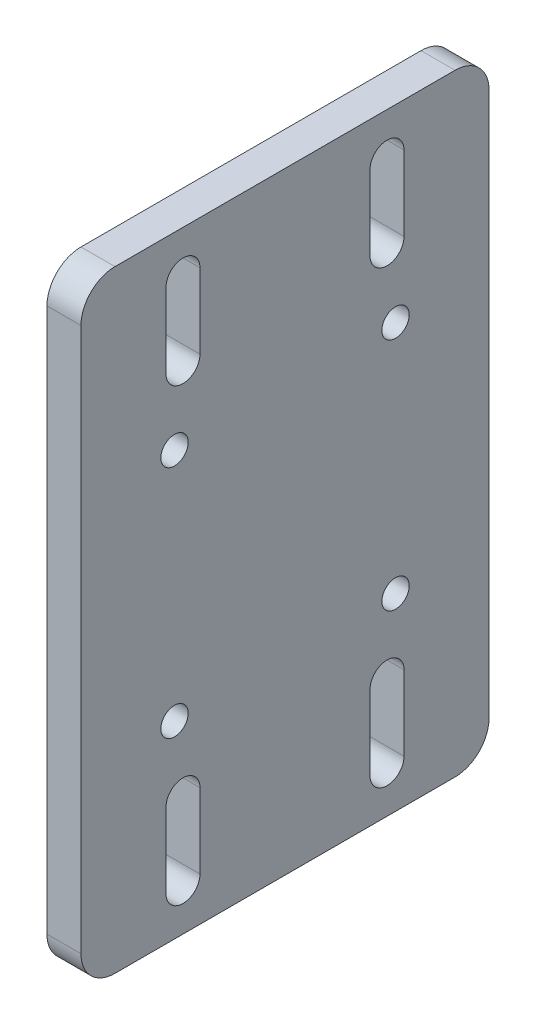
ISO-10303-21;
HEADER;
FILE_DESCRIPTION(('STEP AP214'),'2;1');
FILE_NAME('part.step','',(''),(''),'','','');
FILE_SCHEMA(('AUTOMOTIVE_DESIGN { 1 0 10303 214 1 1 1 1 }'));
ENDSEC;
DATA;
#1=APPLICATION_CONTEXT('core data for automotive mechanical design processes');
#2=APPLICATION_PROTOCOL_DEFINITION('international standard','automotive_design',2000,#1);
#3=PRODUCT_CONTEXT('',#1,'mechanical');
#4=PRODUCT('Part','Part','',(#3));
#5=PRODUCT_RELATED_PRODUCT_CATEGORY('part','',(#4));
#6=PRODUCT_DEFINITION_FORMATION('','',#4);
#7=PRODUCT_DEFINITION_CONTEXT('part definition',#1,'design');
#8=PRODUCT_DEFINITION('design','',#6,#7);
#9=PRODUCT_DEFINITION_SHAPE('','',#8);
#10=(LENGTH_UNIT() NAMED_UNIT(*) SI_UNIT(.MILLI.,.METRE.));
#11=(NAMED_UNIT(*) PLANE_ANGLE_UNIT() SI_UNIT($,.RADIAN.));
#12=(NAMED_UNIT(*) SI_UNIT($,.STERADIAN.) SOLID_ANGLE_UNIT());
#13=UNCERTAINTY_MEASURE_WITH_UNIT(LENGTH_MEASURE(1.E-05),#10,'distance_accuracy_value','');
#14=(GEOMETRIC_REPRESENTATION_CONTEXT(3) GLOBAL_UNCERTAINTY_ASSIGNED_CONTEXT((#13)) GLOBAL_UNIT_ASSIGNED_CONTEXT((#10,
#11,#12)) REPRESENTATION_CONTEXT('',''));
#15=CARTESIAN_POINT('',(0.,0.,0.));
#16=DIRECTION('',(0.,0.,1.));
#17=DIRECTION('',(1.,0.,0.));
#18=AXIS2_PLACEMENT_3D('',#15,#16,#17);
#19=CARTESIAN_POINT('',(6.35,-57.15,-38.1));
#20=DIRECTION('',(0.,0.,1.));
#21=DIRECTION('',(1.,0.,0.));
#22=AXIS2_PLACEMENT_3D('',#19,#20,#21);
#23=PLANE('',#22);
#24=DIRECTION('',(0.,1.,0.));
#25=VECTOR('',#24,1.);
#26=CARTESIAN_POINT('',(6.35,-57.15,-38.1));
#27=LINE('',#26,#25);
#28=CARTESIAN_POINT('',(6.35,-50.8,-38.1));
#29=VERTEX_POINT('',#28);
#30=CARTESIAN_POINT('',(6.35,50.8,-38.1));
#31=VERTEX_POINT('',#30);
#32=EDGE_CURVE('E436',#29,#31,#27,.T.);
#33=ORIENTED_EDGE('',*,*,#32,.F.);
#34=DIRECTION('',(-1.,0.,0.));
#35=VECTOR('',#34,1.);
#36=CARTESIAN_POINT('',(6.35,-50.8,-38.1));
#37=LINE('',#36,#35);
#38=CARTESIAN_POINT('',(0.,-50.8,-38.1));
#39=VERTEX_POINT('',#38);
#40=EDGE_CURVE('E504',#29,#39,#37,.T.);
#41=ORIENTED_EDGE('',*,*,#40,.T.);
#42=DIRECTION('',(0.,1.,0.));
#43=VECTOR('',#42,1.);
#44=CARTESIAN_POINT('',(0.,-57.15,-38.1));
#45=LINE('',#44,#43);
#46=CARTESIAN_POINT('',(0.,50.8,-38.1));
#47=VERTEX_POINT('',#46);
#48=EDGE_CURVE('E435',#39,#47,#45,.T.);
#49=ORIENTED_EDGE('',*,*,#48,.T.);
#50=DIRECTION('',(-1.,0.,0.));
#51=VECTOR('',#50,1.);
#52=CARTESIAN_POINT('',(6.35,50.8,-38.1));
#53=LINE('',#52,#51);
#54=EDGE_CURVE('E501',#47,#31,#53,.F.);
#55=ORIENTED_EDGE('',*,*,#54,.T.);
#56=EDGE_LOOP('',(#33,#41,#49,#55));
#57=FACE_BOUND('',#56,.T.);
#58=ADVANCED_FACE('F53',(#57),#23,.F.);
#59=CARTESIAN_POINT('',(6.35,57.15,38.1));
#60=DIRECTION('',(0.,-1.,0.));
#61=DIRECTION('',(0.,0.,-1.));
#62=AXIS2_PLACEMENT_3D('',#59,#60,#61);
#63=PLANE('',#62);
#64=DIRECTION('',(0.,0.,1.));
#65=VECTOR('',#64,1.);
#66=CARTESIAN_POINT('',(6.35,57.15,38.1));
#67=LINE('',#66,#65);
#68=CARTESIAN_POINT('',(6.35,57.15,-31.75));
#69=VERTEX_POINT('',#68);
#70=CARTESIAN_POINT('',(6.35,57.15,31.75));
#71=VERTEX_POINT('',#70);
#72=EDGE_CURVE('E439',#69,#71,#67,.T.);
#73=ORIENTED_EDGE('',*,*,#72,.F.);
#74=DIRECTION('',(-1.,0.,0.));
#75=VECTOR('',#74,1.);
#76=CARTESIAN_POINT('',(6.35,57.15,-31.75));
#77=LINE('',#76,#75);
#78=CARTESIAN_POINT('',(0.,57.15,-31.75));
#79=VERTEX_POINT('',#78);
#80=EDGE_CURVE('E11',#69,#79,#77,.T.);
#81=ORIENTED_EDGE('',*,*,#80,.T.);
#82=DIRECTION('',(0.,0.,1.));
#83=VECTOR('',#82,1.);
#84=CARTESIAN_POINT('',(0.,57.15,38.1));
#85=LINE('',#84,#83);
#86=CARTESIAN_POINT('',(0.,57.15,31.75));
#87=VERTEX_POINT('',#86);
#88=EDGE_CURVE('E455',#79,#87,#85,.T.);
#89=ORIENTED_EDGE('',*,*,#88,.T.);
#90=DIRECTION('',(-1.,0.,0.));
#91=VECTOR('',#90,1.);
#92=CARTESIAN_POINT('',(6.35,57.15,31.75));
#93=LINE('',#92,#91);
#94=EDGE_CURVE('E62',#87,#71,#93,.F.);
#95=ORIENTED_EDGE('',*,*,#94,.T.);
#96=EDGE_LOOP('',(#73,#81,#89,#95));
#97=FACE_BOUND('',#96,.T.);
#98=ADVANCED_FACE('F521',(#97),#63,.F.);
#99=CARTESIAN_POINT('',(6.35,-57.15,38.1));
#100=DIRECTION('',(0.,0.,-1.));
#101=DIRECTION('',(-1.,0.,0.));
#102=AXIS2_PLACEMENT_3D('',#99,#100,#101);
#103=PLANE('',#102);
#104=DIRECTION('',(0.,-1.,0.));
#105=VECTOR('',#104,1.);
#106=CARTESIAN_POINT('',(0.,-57.15,38.1));
#107=LINE('',#106,#105);
#108=CARTESIAN_POINT('',(0.,50.8,38.1));
#109=VERTEX_POINT('',#108);
#110=CARTESIAN_POINT('',(0.,-50.8,38.1));
#111=VERTEX_POINT('',#110);
#112=EDGE_CURVE('E458',#109,#111,#107,.T.);
#113=ORIENTED_EDGE('',*,*,#112,.T.);
#114=DIRECTION('',(-1.,0.,0.));
#115=VECTOR('',#114,1.);
#116=CARTESIAN_POINT('',(6.35,-50.8,38.1));
#117=LINE('',#116,#115);
#118=CARTESIAN_POINT('',(6.35,-50.8,38.1));
#119=VERTEX_POINT('',#118);
#120=EDGE_CURVE('E487',#111,#119,#117,.F.);
#121=ORIENTED_EDGE('',*,*,#120,.T.);
#122=DIRECTION('',(0.,-1.,0.));
#123=VECTOR('',#122,1.);
#124=CARTESIAN_POINT('',(6.35,-57.15,38.1));
#125=LINE('',#124,#123);
#126=CARTESIAN_POINT('',(6.35,50.8,38.1));
#127=VERTEX_POINT('',#126);
#128=EDGE_CURVE('E443',#127,#119,#125,.T.);
#129=ORIENTED_EDGE('',*,*,#128,.F.);
#130=DIRECTION('',(-1.,0.,0.));
#131=VECTOR('',#130,1.);
#132=CARTESIAN_POINT('',(6.35,50.8,38.1));
#133=LINE('',#132,#131);
#134=EDGE_CURVE('E483',#127,#109,#133,.T.);
#135=ORIENTED_EDGE('',*,*,#134,.T.);
#136=EDGE_LOOP('',(#113,#121,#129,#135));
#137=FACE_BOUND('',#136,.T.);
#138=ADVANCED_FACE('F529',(#137),#103,.F.);
#139=CARTESIAN_POINT('',(6.35,-57.15,38.1));
#140=DIRECTION('',(0.,1.,0.));
#141=DIRECTION('',(0.,0.,1.));
#142=AXIS2_PLACEMENT_3D('',#139,#140,#141);
#143=PLANE('',#142);
#144=DIRECTION('',(0.,0.,-1.));
#145=VECTOR('',#144,1.);
#146=CARTESIAN_POINT('',(6.35,-57.15,38.1));
#147=LINE('',#146,#145);
#148=CARTESIAN_POINT('',(6.35,-57.15,31.75));
#149=VERTEX_POINT('',#148);
#150=CARTESIAN_POINT('',(6.35,-57.15,-31.75));
#151=VERTEX_POINT('',#150);
#152=EDGE_CURVE('E447',#149,#151,#147,.T.);
#153=ORIENTED_EDGE('',*,*,#152,.F.);
#154=DIRECTION('',(-1.,0.,0.));
#155=VECTOR('',#154,1.);
#156=CARTESIAN_POINT('',(6.35,-57.15,31.75));
#157=LINE('',#156,#155);
#158=CARTESIAN_POINT('',(0.,-57.15,31.75));
#159=VERTEX_POINT('',#158);
#160=EDGE_CURVE('E467',#149,#159,#157,.T.);
#161=ORIENTED_EDGE('',*,*,#160,.T.);
#162=DIRECTION('',(0.,0.,-1.));
#163=VECTOR('',#162,1.);
#164=CARTESIAN_POINT('',(0.,-57.15,38.1));
#165=LINE('',#164,#163);
#166=CARTESIAN_POINT('',(0.,-57.15,-31.75));
#167=VERTEX_POINT('',#166);
#168=EDGE_CURVE('E440',#159,#167,#165,.T.);
#169=ORIENTED_EDGE('',*,*,#168,.T.);
#170=DIRECTION('',(-1.,0.,0.));
#171=VECTOR('',#170,1.);
#172=CARTESIAN_POINT('',(6.35,-57.15,-31.75));
#173=LINE('',#172,#171);
#174=EDGE_CURVE('E451',#167,#151,#173,.F.);
#175=ORIENTED_EDGE('',*,*,#174,.T.);
#176=EDGE_LOOP('',(#153,#161,#169,#175));
#177=FACE_BOUND('',#176,.T.);
#178=ADVANCED_FACE('F537',(#177),#143,.F.);
#179=CARTESIAN_POINT('',(6.35,0.,0.));
#180=DIRECTION('',(-1.,0.,0.));
#181=DIRECTION('',(0.,0.,1.));
#182=AXIS2_PLACEMENT_3D('',#179,#180,#181);
#183=PLANE('',#182);
#184=DIRECTION('',(0.,-1.,0.));
#185=VECTOR('',#184,1.);
#186=CARTESIAN_POINT('',(6.35,-49.022,-15.875));
#187=LINE('',#186,#185);
#188=CARTESIAN_POINT('',(6.35,-35.052,-15.875));
#189=VERTEX_POINT('',#188);
#190=CARTESIAN_POINT('',(6.35,-49.022,-15.875));
#191=VERTEX_POINT('',#190);
#192=EDGE_CURVE('E338',#189,#191,#187,.T.);
#193=ORIENTED_EDGE('',*,*,#192,.F.);
#194=CARTESIAN_POINT('',(6.35,-35.052,-19.05));
#195=DIRECTION('',(1.,0.,0.));
#196=DIRECTION('',(0.,0.,-1.));
#197=AXIS2_PLACEMENT_3D('',#194,#195,#196);
#198=CIRCLE('',#197,3.175);
#199=CARTESIAN_POINT('',(6.35,-35.052,-22.225));
#200=VERTEX_POINT('',#199);
#201=EDGE_CURVE('E335',#200,#189,#198,.T.);
#202=ORIENTED_EDGE('',*,*,#201,.F.);
#203=DIRECTION('',(0.,1.,0.));
#204=VECTOR('',#203,1.);
#205=CARTESIAN_POINT('',(6.35,-49.022,-22.225));
#206=LINE('',#205,#204);
#207=CARTESIAN_POINT('',(6.35,-49.022,-22.225));
#208=VERTEX_POINT('',#207);
#209=EDGE_CURVE('E322',#208,#200,#206,.T.);
#210=ORIENTED_EDGE('',*,*,#209,.F.);
#211=CARTESIAN_POINT('',(6.35,-49.022,-19.05));
#212=DIRECTION('',(1.,0.,0.));
#213=DIRECTION('',(0.,0.,-1.));
#214=AXIS2_PLACEMENT_3D('',#211,#212,#213);
#215=CIRCLE('',#214,3.175);
#216=EDGE_CURVE('E342',#191,#208,#215,.T.);
#217=ORIENTED_EDGE('',*,*,#216,.F.);
#218=EDGE_LOOP('',(#193,#202,#210,#217));
#219=FACE_BOUND('',#218,.T.);
#220=DIRECTION('',(0.,1.,0.));
#221=VECTOR('',#220,1.);
#222=CARTESIAN_POINT('',(6.35,-49.022,15.875));
#223=LINE('',#222,#221);
#224=CARTESIAN_POINT('',(6.35,-49.022,15.875));
#225=VERTEX_POINT('',#224);
#226=CARTESIAN_POINT('',(6.35,-35.052,15.875));
#227=VERTEX_POINT('',#226);
#228=EDGE_CURVE('E294',#225,#227,#223,.T.);
#229=ORIENTED_EDGE('',*,*,#228,.F.);
#230=CARTESIAN_POINT('',(6.35,-49.022,19.05));
#231=DIRECTION('',(1.,0.,0.));
#232=DIRECTION('',(0.,0.,1.));
#233=AXIS2_PLACEMENT_3D('',#230,#231,#232);
#234=CIRCLE('',#233,3.175);
#235=CARTESIAN_POINT('',(6.35,-49.022,22.225));
#236=VERTEX_POINT('',#235);
#237=EDGE_CURVE('E291',#236,#225,#234,.T.);
#238=ORIENTED_EDGE('',*,*,#237,.F.);
#239=DIRECTION('',(0.,-1.,0.));
#240=VECTOR('',#239,1.);
#241=CARTESIAN_POINT('',(6.35,-49.022,22.225));
#242=LINE('',#241,#240);
#243=CARTESIAN_POINT('',(6.35,-35.052,22.225));
#244=VERTEX_POINT('',#243);
#245=EDGE_CURVE('E278',#244,#236,#242,.T.);
#246=ORIENTED_EDGE('',*,*,#245,.F.);
#247=CARTESIAN_POINT('',(6.35,-35.052,19.05));
#248=DIRECTION('',(1.,0.,0.));
#249=DIRECTION('',(0.,0.,1.));
#250=AXIS2_PLACEMENT_3D('',#247,#248,#249);
#251=CIRCLE('',#250,3.175);
#252=EDGE_CURVE('E299',#227,#244,#251,.T.);
#253=ORIENTED_EDGE('',*,*,#252,.F.);
#254=EDGE_LOOP('',(#229,#238,#246,#253));
#255=FACE_BOUND('',#254,.T.);
#256=DIRECTION('',(0.,1.,0.));
#257=VECTOR('',#256,1.);
#258=CARTESIAN_POINT('',(6.35,49.022,15.875));
#259=LINE('',#258,#257);
#260=CARTESIAN_POINT('',(6.35,35.052,15.875));
#261=VERTEX_POINT('',#260);
#262=CARTESIAN_POINT('',(6.35,49.022,15.875));
#263=VERTEX_POINT('',#262);
#264=EDGE_CURVE('E257',#261,#263,#259,.T.);
#265=ORIENTED_EDGE('',*,*,#264,.F.);
#266=CARTESIAN_POINT('',(6.35,35.052,19.05));
#267=DIRECTION('',(1.,0.,0.));
#268=DIRECTION('',(0.,0.,-1.));
#269=AXIS2_PLACEMENT_3D('',#266,#267,#268);
#270=CIRCLE('',#269,3.175);
#271=CARTESIAN_POINT('',(6.35,35.052,22.225));
#272=VERTEX_POINT('',#271);
#273=EDGE_CURVE('E223',#272,#261,#270,.T.);
#274=ORIENTED_EDGE('',*,*,#273,.F.);
#275=DIRECTION('',(0.,-1.,0.));
#276=VECTOR('',#275,1.);
#277=CARTESIAN_POINT('',(6.35,49.022,22.225));
#278=LINE('',#277,#276);
#279=CARTESIAN_POINT('',(6.35,49.022,22.225));
#280=VERTEX_POINT('',#279);
#281=EDGE_CURVE('E244',#280,#272,#278,.T.);
#282=ORIENTED_EDGE('',*,*,#281,.F.);
#283=CARTESIAN_POINT('',(6.35,49.022,19.05));
#284=DIRECTION('',(1.,0.,0.));
#285=DIRECTION('',(0.,0.,-1.));
#286=AXIS2_PLACEMENT_3D('',#283,#284,#285);
#287=CIRCLE('',#286,3.175);
#288=EDGE_CURVE('E248',#263,#280,#287,.T.);
#289=ORIENTED_EDGE('',*,*,#288,.F.);
#290=EDGE_LOOP('',(#265,#274,#282,#289));
#291=FACE_BOUND('',#290,.T.);
#292=DIRECTION('',(0.,1.,0.));
#293=VECTOR('',#292,1.);
#294=CARTESIAN_POINT('',(6.35,49.022,-22.225));
#295=LINE('',#294,#293);
#296=CARTESIAN_POINT('',(6.35,35.052,-22.225));
#297=VERTEX_POINT('',#296);
#298=CARTESIAN_POINT('',(6.35,49.022,-22.225));
#299=VERTEX_POINT('',#298);
#300=EDGE_CURVE('E380',#297,#299,#295,.T.);
#301=ORIENTED_EDGE('',*,*,#300,.F.);
#302=CARTESIAN_POINT('',(6.35,35.052,-19.05));
#303=DIRECTION('',(1.,0.,0.));
#304=DIRECTION('',(0.,0.,1.));
#305=AXIS2_PLACEMENT_3D('',#302,#303,#304);
#306=CIRCLE('',#305,3.175);
#307=CARTESIAN_POINT('',(6.35,35.052,-15.875));
#308=VERTEX_POINT('',#307);
#309=EDGE_CURVE('E267',#308,#297,#306,.T.);
#310=ORIENTED_EDGE('',*,*,#309,.F.);
#311=DIRECTION('',(0.,-1.,0.));
#312=VECTOR('',#311,1.);
#313=CARTESIAN_POINT('',(6.35,49.022,-15.875));
#314=LINE('',#313,#312);
#315=CARTESIAN_POINT('',(6.35,49.022,-15.875));
#316=VERTEX_POINT('',#315);
#317=EDGE_CURVE('E365',#316,#308,#314,.T.);
#318=ORIENTED_EDGE('',*,*,#317,.F.);
#319=CARTESIAN_POINT('',(6.35,49.022,-19.05));
#320=DIRECTION('',(1.,0.,0.));
#321=DIRECTION('',(0.,0.,1.));
#322=AXIS2_PLACEMENT_3D('',#319,#320,#321);
#323=CIRCLE('',#322,3.175);
#324=EDGE_CURVE('E384',#299,#316,#323,.T.);
#325=ORIENTED_EDGE('',*,*,#324,.F.);
#326=EDGE_LOOP('',(#301,#310,#318,#325));
#327=FACE_BOUND('',#326,.T.);
#328=CARTESIAN_POINT('',(6.35,21.9075,20.6375));
#329=DIRECTION('',(1.,0.,0.));
#330=DIRECTION('',(0.,0.,-1.));
#331=AXIS2_PLACEMENT_3D('',#328,#329,#330);
#332=CIRCLE('',#331,2.55269999999999);
#333=CARTESIAN_POINT('',(6.35,21.9075,18.0848));
#334=VERTEX_POINT('',#333);
#335=EDGE_CURVE('E394',#334,#334,#332,.T.);
#336=ORIENTED_EDGE('',*,*,#335,.F.);
#337=EDGE_LOOP('',(#336));
#338=FACE_BOUND('',#337,.T.);
#339=CARTESIAN_POINT('',(6.35,21.9075,-20.6375));
#340=DIRECTION('',(1.,0.,0.));
#341=DIRECTION('',(0.,0.,-1.));
#342=AXIS2_PLACEMENT_3D('',#339,#340,#341);
#343=CIRCLE('',#342,2.55269999999999);
#344=CARTESIAN_POINT('',(6.35,21.9075,-23.1902));
#345=VERTEX_POINT('',#344);
#346=EDGE_CURVE('E411',#345,#345,#343,.T.);
#347=ORIENTED_EDGE('',*,*,#346,.F.);
#348=EDGE_LOOP('',(#347));
#349=FACE_BOUND('',#348,.T.);
#350=CARTESIAN_POINT('',(6.35,-21.9075,-20.6375));
#351=DIRECTION('',(1.,0.,0.));
#352=DIRECTION('',(0.,0.,-1.));
#353=AXIS2_PLACEMENT_3D('',#350,#351,#352);
#354=CIRCLE('',#353,2.55269999999999);
#355=CARTESIAN_POINT('',(6.35,-21.9075,-23.1902));
#356=VERTEX_POINT('',#355);
#357=EDGE_CURVE('E419',#356,#356,#354,.T.);
#358=ORIENTED_EDGE('',*,*,#357,.F.);
#359=EDGE_LOOP('',(#358));
#360=FACE_BOUND('',#359,.T.);
#361=CARTESIAN_POINT('',(6.35,-21.9075,20.6375));
#362=DIRECTION('',(1.,0.,0.));
#363=DIRECTION('',(0.,0.,-1.));
#364=AXIS2_PLACEMENT_3D('',#361,#362,#363);
#365=CIRCLE('',#364,2.55269999999999);
#366=CARTESIAN_POINT('',(6.35,-21.9075,18.0848));
#367=VERTEX_POINT('',#366);
#368=EDGE_CURVE('E427',#367,#367,#365,.T.);
#369=ORIENTED_EDGE('',*,*,#368,.F.);
#370=EDGE_LOOP('',(#369));
#371=FACE_BOUND('',#370,.T.);
#372=ORIENTED_EDGE('',*,*,#128,.T.);
#373=CARTESIAN_POINT('',(6.35,-50.8,31.75));
#374=DIRECTION('',(-1.,0.,0.));
#375=DIRECTION('',(0.,0.,1.));
#376=AXIS2_PLACEMENT_3D('',#373,#374,#375);
#377=CIRCLE('',#376,6.35);
#378=EDGE_CURVE('E498',#119,#149,#377,.F.);
#379=ORIENTED_EDGE('',*,*,#378,.T.);
#380=ORIENTED_EDGE('',*,*,#152,.T.);
#381=CARTESIAN_POINT('',(6.35,-50.8,-31.75));
#382=DIRECTION('',(-1.,0.,0.));
#383=DIRECTION('',(0.,0.,1.));
#384=AXIS2_PLACEMENT_3D('',#381,#382,#383);
#385=CIRCLE('',#384,6.35);
#386=EDGE_CURVE('E495',#151,#29,#385,.F.);
#387=ORIENTED_EDGE('',*,*,#386,.T.);
#388=ORIENTED_EDGE('',*,*,#32,.T.);
#389=CARTESIAN_POINT('',(6.35,50.8,-31.75));
#390=DIRECTION('',(-1.,0.,0.));
#391=DIRECTION('',(0.,0.,1.));
#392=AXIS2_PLACEMENT_3D('',#389,#390,#391);
#393=CIRCLE('',#392,6.35);
#394=EDGE_CURVE('E75',#31,#69,#393,.F.);
#395=ORIENTED_EDGE('',*,*,#394,.T.);
#396=ORIENTED_EDGE('',*,*,#72,.T.);
#397=CARTESIAN_POINT('',(6.35,50.8,31.75));
#398=DIRECTION('',(-1.,0.,0.));
#399=DIRECTION('',(0.,0.,1.));
#400=AXIS2_PLACEMENT_3D('',#397,#398,#399);
#401=CIRCLE('',#400,6.35);
#402=EDGE_CURVE('E490',#71,#127,#401,.F.);
#403=ORIENTED_EDGE('',*,*,#402,.T.);
#404=EDGE_LOOP('',(#372,#379,#380,#387,#388,#395,#396,#403));
#405=FACE_BOUND('',#404,.T.);
#406=ADVANCED_FACE('F523',(#219,#255,#291,#327,#338,#349,#360,#371,#405),#183,.F.);
#407=CARTESIAN_POINT('',(0.,0.,0.));
#408=DIRECTION('',(-1.,0.,0.));
#409=DIRECTION('',(0.,0.,1.));
#410=AXIS2_PLACEMENT_3D('',#407,#408,#409);
#411=PLANE('',#410);
#412=CARTESIAN_POINT('',(0.,-35.052,-19.05));
#413=DIRECTION('',(1.,0.,0.));
#414=DIRECTION('',(0.,0.,-1.));
#415=AXIS2_PLACEMENT_3D('',#412,#413,#414);
#416=CIRCLE('',#415,3.175);
#417=CARTESIAN_POINT('',(0.,-35.052,-22.225));
#418=VERTEX_POINT('',#417);
#419=CARTESIAN_POINT('',(0.,-35.052,-15.875));
#420=VERTEX_POINT('',#419);
#421=EDGE_CURVE('E317',#418,#420,#416,.T.);
#422=ORIENTED_EDGE('',*,*,#421,.T.);
#423=DIRECTION('',(0.,-1.,0.));
#424=VECTOR('',#423,1.);
#425=CARTESIAN_POINT('',(0.,-49.022,-15.875));
#426=LINE('',#425,#424);
#427=CARTESIAN_POINT('',(0.,-49.022,-15.875));
#428=VERTEX_POINT('',#427);
#429=EDGE_CURVE('E321',#420,#428,#426,.T.);
#430=ORIENTED_EDGE('',*,*,#429,.T.);
#431=CARTESIAN_POINT('',(0.,-49.022,-19.05));
#432=DIRECTION('',(1.,0.,0.));
#433=DIRECTION('',(0.,0.,-1.));
#434=AXIS2_PLACEMENT_3D('',#431,#432,#433);
#435=CIRCLE('',#434,3.175);
#436=CARTESIAN_POINT('',(0.,-49.022,-22.225));
#437=VERTEX_POINT('',#436);
#438=EDGE_CURVE('E326',#428,#437,#435,.T.);
#439=ORIENTED_EDGE('',*,*,#438,.T.);
#440=DIRECTION('',(0.,1.,0.));
#441=VECTOR('',#440,1.);
#442=CARTESIAN_POINT('',(0.,-49.022,-22.225));
#443=LINE('',#442,#441);
#444=EDGE_CURVE('E330',#437,#418,#443,.T.);
#445=ORIENTED_EDGE('',*,*,#444,.T.);
#446=EDGE_LOOP('',(#422,#430,#439,#445));
#447=FACE_BOUND('',#446,.T.);
#448=CARTESIAN_POINT('',(0.,-49.022,19.05));
#449=DIRECTION('',(1.,0.,0.));
#450=DIRECTION('',(0.,0.,1.));
#451=AXIS2_PLACEMENT_3D('',#448,#449,#450);
#452=CIRCLE('',#451,3.175);
#453=CARTESIAN_POINT('',(0.,-49.022,22.225));
#454=VERTEX_POINT('',#453);
#455=CARTESIAN_POINT('',(0.,-49.022,15.875));
#456=VERTEX_POINT('',#455);
#457=EDGE_CURVE('E273',#454,#456,#452,.T.);
#458=ORIENTED_EDGE('',*,*,#457,.T.);
#459=DIRECTION('',(0.,1.,0.));
#460=VECTOR('',#459,1.);
#461=CARTESIAN_POINT('',(0.,-49.022,15.875));
#462=LINE('',#461,#460);
#463=CARTESIAN_POINT('',(0.,-35.052,15.875));
#464=VERTEX_POINT('',#463);
#465=EDGE_CURVE('E277',#456,#464,#462,.T.);
#466=ORIENTED_EDGE('',*,*,#465,.T.);
#467=CARTESIAN_POINT('',(0.,-35.052,19.05));
#468=DIRECTION('',(1.,0.,0.));
#469=DIRECTION('',(0.,0.,1.));
#470=AXIS2_PLACEMENT_3D('',#467,#468,#469);
#471=CIRCLE('',#470,3.175);
#472=CARTESIAN_POINT('',(0.,-35.052,22.225));
#473=VERTEX_POINT('',#472);
#474=EDGE_CURVE('E282',#464,#473,#471,.T.);
#475=ORIENTED_EDGE('',*,*,#474,.T.);
#476=DIRECTION('',(0.,-1.,0.));
#477=VECTOR('',#476,1.);
#478=CARTESIAN_POINT('',(0.,-49.022,22.225));
#479=LINE('',#478,#477);
#480=EDGE_CURVE('E286',#473,#454,#479,.T.);
#481=ORIENTED_EDGE('',*,*,#480,.T.);
#482=EDGE_LOOP('',(#458,#466,#475,#481));
#483=FACE_BOUND('',#482,.T.);
#484=CARTESIAN_POINT('',(0.,35.052,19.05));
#485=DIRECTION('',(1.,0.,0.));
#486=DIRECTION('',(0.,0.,-1.));
#487=AXIS2_PLACEMENT_3D('',#484,#485,#486);
#488=CIRCLE('',#487,3.175);
#489=CARTESIAN_POINT('',(0.,35.052,22.225));
#490=VERTEX_POINT('',#489);
#491=CARTESIAN_POINT('',(0.,35.052,15.875));
#492=VERTEX_POINT('',#491);
#493=EDGE_CURVE('E220',#490,#492,#488,.T.);
#494=ORIENTED_EDGE('',*,*,#493,.T.);
#495=DIRECTION('',(0.,1.,0.));
#496=VECTOR('',#495,1.);
#497=CARTESIAN_POINT('',(0.,49.022,15.875));
#498=LINE('',#497,#496);
#499=CARTESIAN_POINT('',(0.,49.022,15.875));
#500=VERTEX_POINT('',#499);
#501=EDGE_CURVE('E233',#492,#500,#498,.T.);
#502=ORIENTED_EDGE('',*,*,#501,.T.);
#503=CARTESIAN_POINT('',(0.,49.022,19.05));
#504=DIRECTION('',(1.,0.,0.));
#505=DIRECTION('',(0.,0.,-1.));
#506=AXIS2_PLACEMENT_3D('',#503,#504,#505);
#507=CIRCLE('',#506,3.175);
#508=CARTESIAN_POINT('',(0.,49.022,22.225));
#509=VERTEX_POINT('',#508);
#510=EDGE_CURVE('E238',#500,#509,#507,.T.);
#511=ORIENTED_EDGE('',*,*,#510,.T.);
#512=DIRECTION('',(0.,-1.,0.));
#513=VECTOR('',#512,1.);
#514=CARTESIAN_POINT('',(0.,49.022,22.225));
#515=LINE('',#514,#513);
#516=EDGE_CURVE('E229',#509,#490,#515,.T.);
#517=ORIENTED_EDGE('',*,*,#516,.T.);
#518=EDGE_LOOP('',(#494,#502,#511,#517));
#519=FACE_BOUND('',#518,.T.);
#520=CARTESIAN_POINT('',(0.,35.052,-19.05));
#521=DIRECTION('',(1.,0.,0.));
#522=DIRECTION('',(0.,0.,1.));
#523=AXIS2_PLACEMENT_3D('',#520,#521,#522);
#524=CIRCLE('',#523,3.175);
#525=CARTESIAN_POINT('',(0.,35.052,-15.875));
#526=VERTEX_POINT('',#525);
#527=CARTESIAN_POINT('',(0.,35.052,-22.225));
#528=VERTEX_POINT('',#527);
#529=EDGE_CURVE('E360',#526,#528,#524,.T.);
#530=ORIENTED_EDGE('',*,*,#529,.T.);
#531=DIRECTION('',(0.,1.,0.));
#532=VECTOR('',#531,1.);
#533=CARTESIAN_POINT('',(0.,49.022,-22.225));
#534=LINE('',#533,#532);
#535=CARTESIAN_POINT('',(0.,49.022,-22.225));
#536=VERTEX_POINT('',#535);
#537=EDGE_CURVE('E364',#528,#536,#534,.T.);
#538=ORIENTED_EDGE('',*,*,#537,.T.);
#539=CARTESIAN_POINT('',(0.,49.022,-19.05));
#540=DIRECTION('',(1.,0.,0.));
#541=DIRECTION('',(0.,0.,1.));
#542=AXIS2_PLACEMENT_3D('',#539,#540,#541);
#543=CIRCLE('',#542,3.175);
#544=CARTESIAN_POINT('',(0.,49.022,-15.875));
#545=VERTEX_POINT('',#544);
#546=EDGE_CURVE('E369',#536,#545,#543,.T.);
#547=ORIENTED_EDGE('',*,*,#546,.T.);
#548=DIRECTION('',(0.,-1.,0.));
#549=VECTOR('',#548,1.);
#550=CARTESIAN_POINT('',(0.,49.022,-15.875));
#551=LINE('',#550,#549);
#552=EDGE_CURVE('E373',#545,#526,#551,.T.);
#553=ORIENTED_EDGE('',*,*,#552,.T.);
#554=EDGE_LOOP('',(#530,#538,#547,#553));
#555=FACE_BOUND('',#554,.T.);
#556=CARTESIAN_POINT('',(0.,21.9075,20.6375));
#557=DIRECTION('',(1.,0.,0.));
#558=DIRECTION('',(0.,0.,-1.));
#559=AXIS2_PLACEMENT_3D('',#556,#557,#558);
#560=CIRCLE('',#559,2.5527);
#561=CARTESIAN_POINT('',(0.,21.9075,18.0848));
#562=VERTEX_POINT('',#561);
#563=EDGE_CURVE('E407',#562,#562,#560,.T.);
#564=ORIENTED_EDGE('',*,*,#563,.T.);
#565=EDGE_LOOP('',(#564));
#566=FACE_BOUND('',#565,.T.);
#567=CARTESIAN_POINT('',(0.,21.9075,-20.6375));
#568=DIRECTION('',(1.,0.,0.));
#569=DIRECTION('',(0.,0.,-1.));
#570=AXIS2_PLACEMENT_3D('',#567,#568,#569);
#571=CIRCLE('',#570,2.5527);
#572=CARTESIAN_POINT('',(0.,21.9075,-23.1902));
#573=VERTEX_POINT('',#572);
#574=EDGE_CURVE('E415',#573,#573,#571,.T.);
#575=ORIENTED_EDGE('',*,*,#574,.T.);
#576=EDGE_LOOP('',(#575));
#577=FACE_BOUND('',#576,.T.);
#578=CARTESIAN_POINT('',(0.,-21.9075,-20.6375));
#579=DIRECTION('',(1.,0.,0.));
#580=DIRECTION('',(0.,0.,-1.));
#581=AXIS2_PLACEMENT_3D('',#578,#579,#580);
#582=CIRCLE('',#581,2.5527);
#583=CARTESIAN_POINT('',(0.,-21.9075,-23.1902));
#584=VERTEX_POINT('',#583);
#585=EDGE_CURVE('E423',#584,#584,#582,.T.);
#586=ORIENTED_EDGE('',*,*,#585,.T.);
#587=EDGE_LOOP('',(#586));
#588=FACE_BOUND('',#587,.T.);
#589=CARTESIAN_POINT('',(0.,-21.9075,20.6375));
#590=DIRECTION('',(1.,0.,0.));
#591=DIRECTION('',(0.,0.,-1.));
#592=AXIS2_PLACEMENT_3D('',#589,#590,#591);
#593=CIRCLE('',#592,2.5527);
#594=CARTESIAN_POINT('',(0.,-21.9075,18.0848));
#595=VERTEX_POINT('',#594);
#596=EDGE_CURVE('E431',#595,#595,#593,.T.);
#597=ORIENTED_EDGE('',*,*,#596,.T.);
#598=EDGE_LOOP('',(#597));
#599=FACE_BOUND('',#598,.T.);
#600=ORIENTED_EDGE('',*,*,#168,.F.);
#601=CARTESIAN_POINT('',(0.,-50.8,31.75));
#602=DIRECTION('',(-1.,0.,0.));
#603=DIRECTION('',(0.,0.,1.));
#604=AXIS2_PLACEMENT_3D('',#601,#602,#603);
#605=CIRCLE('',#604,6.35);
#606=EDGE_CURVE('E480',#159,#111,#605,.T.);
#607=ORIENTED_EDGE('',*,*,#606,.T.);
#608=ORIENTED_EDGE('',*,*,#112,.F.);
#609=CARTESIAN_POINT('',(0.,50.8,31.75));
#610=DIRECTION('',(-1.,0.,0.));
#611=DIRECTION('',(0.,0.,1.));
#612=AXIS2_PLACEMENT_3D('',#609,#610,#611);
#613=CIRCLE('',#612,6.35);
#614=EDGE_CURVE('E471',#109,#87,#613,.T.);
#615=ORIENTED_EDGE('',*,*,#614,.T.);
#616=ORIENTED_EDGE('',*,*,#88,.F.);
#617=CARTESIAN_POINT('',(0.,50.8,-31.75));
#618=DIRECTION('',(-1.,0.,0.));
#619=DIRECTION('',(0.,0.,1.));
#620=AXIS2_PLACEMENT_3D('',#617,#618,#619);
#621=CIRCLE('',#620,6.35);
#622=EDGE_CURVE('E474',#79,#47,#621,.T.);
#623=ORIENTED_EDGE('',*,*,#622,.T.);
#624=ORIENTED_EDGE('',*,*,#48,.F.);
#625=CARTESIAN_POINT('',(0.,-50.8,-31.75));
#626=DIRECTION('',(-1.,0.,0.));
#627=DIRECTION('',(0.,0.,1.));
#628=AXIS2_PLACEMENT_3D('',#625,#626,#627);
#629=CIRCLE('',#628,6.35);
#630=EDGE_CURVE('E477',#39,#167,#629,.T.);
#631=ORIENTED_EDGE('',*,*,#630,.T.);
#632=EDGE_LOOP('',(#600,#607,#608,#615,#616,#623,#624,#631));
#633=FACE_BOUND('',#632,.T.);
#634=ADVANCED_FACE('F240',(#447,#483,#519,#555,#566,#577,#588,#599,#633),#411,.T.);
#635=CARTESIAN_POINT('',(6.35,-21.9075,20.6375));
#636=DIRECTION('',(1.,0.,0.));
#637=DIRECTION('',(0.,0.,-1.));
#638=AXIS2_PLACEMENT_3D('',#635,#636,#637);
#639=CYLINDRICAL_SURFACE('',#638,2.55269999999999);
#640=ORIENTED_EDGE('',*,*,#596,.F.);
#641=EDGE_LOOP('',(#640));
#642=FACE_BOUND('',#641,.T.);
#643=ORIENTED_EDGE('',*,*,#368,.T.);
#644=EDGE_LOOP('',(#643));
#645=FACE_BOUND('',#644,.T.);
#646=ADVANCED_FACE('F562',(#642,#645),#639,.F.);
#647=CARTESIAN_POINT('',(6.35,-21.9075,-20.6375));
#648=DIRECTION('',(1.,0.,0.));
#649=DIRECTION('',(0.,0.,-1.));
#650=AXIS2_PLACEMENT_3D('',#647,#648,#649);
#651=CYLINDRICAL_SURFACE('',#650,2.55269999999999);
#652=ORIENTED_EDGE('',*,*,#585,.F.);
#653=EDGE_LOOP('',(#652));
#654=FACE_BOUND('',#653,.T.);
#655=ORIENTED_EDGE('',*,*,#357,.T.);
#656=EDGE_LOOP('',(#655));
#657=FACE_BOUND('',#656,.T.);
#658=ADVANCED_FACE('F569',(#654,#657),#651,.F.);
#659=CARTESIAN_POINT('',(6.35,21.9075,-20.6375));
#660=DIRECTION('',(1.,0.,0.));
#661=DIRECTION('',(0.,0.,-1.));
#662=AXIS2_PLACEMENT_3D('',#659,#660,#661);
#663=CYLINDRICAL_SURFACE('',#662,2.55269999999999);
#664=ORIENTED_EDGE('',*,*,#574,.F.);
#665=EDGE_LOOP('',(#664));
#666=FACE_BOUND('',#665,.T.);
#667=ORIENTED_EDGE('',*,*,#346,.T.);
#668=EDGE_LOOP('',(#667));
#669=FACE_BOUND('',#668,.T.);
#670=ADVANCED_FACE('F573',(#666,#669),#663,.F.);
#671=CARTESIAN_POINT('',(6.35,21.9075,20.6375));
#672=DIRECTION('',(1.,0.,0.));
#673=DIRECTION('',(0.,0.,-1.));
#674=AXIS2_PLACEMENT_3D('',#671,#672,#673);
#675=CYLINDRICAL_SURFACE('',#674,2.55269999999999);
#676=ORIENTED_EDGE('',*,*,#563,.F.);
#677=EDGE_LOOP('',(#676));
#678=FACE_BOUND('',#677,.T.);
#679=ORIENTED_EDGE('',*,*,#335,.T.);
#680=EDGE_LOOP('',(#679));
#681=FACE_BOUND('',#680,.T.);
#682=ADVANCED_FACE('F577',(#678,#681),#675,.F.);
#683=CARTESIAN_POINT('',(0.,35.052,-19.05));
#684=DIRECTION('',(1.,0.,0.));
#685=DIRECTION('',(0.,0.,-1.));
#686=AXIS2_PLACEMENT_3D('',#683,#684,#685);
#687=CYLINDRICAL_SURFACE('',#686,3.175);
#688=ORIENTED_EDGE('',*,*,#309,.T.);
#689=DIRECTION('',(1.,0.,0.));
#690=VECTOR('',#689,1.);
#691=CARTESIAN_POINT('',(0.,35.052,-22.225));
#692=LINE('',#691,#690);
#693=EDGE_CURVE('E377',#528,#297,#692,.T.);
#694=ORIENTED_EDGE('',*,*,#693,.F.);
#695=ORIENTED_EDGE('',*,*,#529,.F.);
#696=DIRECTION('',(1.,0.,0.));
#697=VECTOR('',#696,1.);
#698=CARTESIAN_POINT('',(0.,35.052,-15.875));
#699=LINE('',#698,#697);
#700=EDGE_CURVE('E391',#526,#308,#699,.T.);
#701=ORIENTED_EDGE('',*,*,#700,.T.);
#702=EDGE_LOOP('',(#688,#694,#695,#701));
#703=FACE_BOUND('',#702,.T.);
#704=ADVANCED_FACE('F581',(#703),#687,.F.);
#705=CARTESIAN_POINT('',(0.,49.022,-15.875));
#706=DIRECTION('',(0.,0.,1.));
#707=DIRECTION('',(0.,-1.,0.));
#708=AXIS2_PLACEMENT_3D('',#705,#706,#707);
#709=PLANE('',#708);
#710=ORIENTED_EDGE('',*,*,#317,.T.);
#711=ORIENTED_EDGE('',*,*,#700,.F.);
#712=ORIENTED_EDGE('',*,*,#552,.F.);
#713=DIRECTION('',(1.,0.,0.));
#714=VECTOR('',#713,1.);
#715=CARTESIAN_POINT('',(0.,49.022,-15.875));
#716=LINE('',#715,#714);
#717=EDGE_CURVE('E395',#545,#316,#716,.T.);
#718=ORIENTED_EDGE('',*,*,#717,.T.);
#719=EDGE_LOOP('',(#710,#711,#712,#718));
#720=FACE_BOUND('',#719,.T.);
#721=ADVANCED_FACE('F585',(#720),#709,.F.);
#722=CARTESIAN_POINT('',(0.,49.022,-19.05));
#723=DIRECTION('',(1.,0.,0.));
#724=DIRECTION('',(0.,0.,-1.));
#725=AXIS2_PLACEMENT_3D('',#722,#723,#724);
#726=CYLINDRICAL_SURFACE('',#725,3.175);
#727=ORIENTED_EDGE('',*,*,#324,.T.);
#728=ORIENTED_EDGE('',*,*,#717,.F.);
#729=ORIENTED_EDGE('',*,*,#546,.F.);
#730=DIRECTION('',(1.,0.,0.));
#731=VECTOR('',#730,1.);
#732=CARTESIAN_POINT('',(0.,49.022,-22.225));
#733=LINE('',#732,#731);
#734=EDGE_CURVE('E398',#536,#299,#733,.T.);
#735=ORIENTED_EDGE('',*,*,#734,.T.);
#736=EDGE_LOOP('',(#727,#728,#729,#735));
#737=FACE_BOUND('',#736,.T.);
#738=ADVANCED_FACE('F590',(#737),#726,.F.);
#739=CARTESIAN_POINT('',(0.,49.022,-22.225));
#740=DIRECTION('',(0.,0.,-1.));
#741=DIRECTION('',(0.,1.,0.));
#742=AXIS2_PLACEMENT_3D('',#739,#740,#741);
#743=PLANE('',#742);
#744=ORIENTED_EDGE('',*,*,#300,.T.);
#745=ORIENTED_EDGE('',*,*,#734,.F.);
#746=ORIENTED_EDGE('',*,*,#537,.F.);
#747=ORIENTED_EDGE('',*,*,#693,.T.);
#748=EDGE_LOOP('',(#744,#745,#746,#747));
#749=FACE_BOUND('',#748,.T.);
#750=ADVANCED_FACE('F587',(#749),#743,.F.);
#751=CARTESIAN_POINT('',(0.,35.052,19.05));
#752=DIRECTION('',(1.,0.,0.));
#753=DIRECTION('',(0.,0.,-1.));
#754=AXIS2_PLACEMENT_3D('',#751,#752,#753);
#755=CYLINDRICAL_SURFACE('',#754,3.175);
#756=ORIENTED_EDGE('',*,*,#273,.T.);
#757=DIRECTION('',(1.,0.,0.));
#758=VECTOR('',#757,1.);
#759=CARTESIAN_POINT('',(0.,35.052,15.875));
#760=LINE('',#759,#758);
#761=EDGE_CURVE('E216',#492,#261,#760,.T.);
#762=ORIENTED_EDGE('',*,*,#761,.F.);
#763=ORIENTED_EDGE('',*,*,#493,.F.);
#764=DIRECTION('',(1.,0.,0.));
#765=VECTOR('',#764,1.);
#766=CARTESIAN_POINT('',(0.,35.052,22.225));
#767=LINE('',#766,#765);
#768=EDGE_CURVE('E264',#490,#272,#767,.T.);
#769=ORIENTED_EDGE('',*,*,#768,.T.);
#770=EDGE_LOOP('',(#756,#762,#763,#769));
#771=FACE_BOUND('',#770,.T.);
#772=ADVANCED_FACE('F218',(#771),#755,.F.);
#773=CARTESIAN_POINT('',(0.,49.022,22.225));
#774=DIRECTION('',(0.,0.,1.));
#775=DIRECTION('',(0.,-1.,0.));
#776=AXIS2_PLACEMENT_3D('',#773,#774,#775);
#777=PLANE('',#776);
#778=ORIENTED_EDGE('',*,*,#281,.T.);
#779=ORIENTED_EDGE('',*,*,#768,.F.);
#780=ORIENTED_EDGE('',*,*,#516,.F.);
#781=DIRECTION('',(1.,0.,0.));
#782=VECTOR('',#781,1.);
#783=CARTESIAN_POINT('',(0.,49.022,22.225));
#784=LINE('',#783,#782);
#785=EDGE_CURVE('E268',#509,#280,#784,.T.);
#786=ORIENTED_EDGE('',*,*,#785,.T.);
#787=EDGE_LOOP('',(#778,#779,#780,#786));
#788=FACE_BOUND('',#787,.T.);
#789=ADVANCED_FACE('F630',(#788),#777,.F.);
#790=CARTESIAN_POINT('',(0.,49.022,19.05));
#791=DIRECTION('',(1.,0.,0.));
#792=DIRECTION('',(0.,0.,-1.));
#793=AXIS2_PLACEMENT_3D('',#790,#791,#792);
#794=CYLINDRICAL_SURFACE('',#793,3.175);
#795=ORIENTED_EDGE('',*,*,#288,.T.);
#796=ORIENTED_EDGE('',*,*,#785,.F.);
#797=ORIENTED_EDGE('',*,*,#510,.F.);
#798=DIRECTION('',(1.,0.,0.));
#799=VECTOR('',#798,1.);
#800=CARTESIAN_POINT('',(0.,49.022,15.875));
#801=LINE('',#800,#799);
#802=EDGE_CURVE('E228',#500,#263,#801,.T.);
#803=ORIENTED_EDGE('',*,*,#802,.T.);
#804=EDGE_LOOP('',(#795,#796,#797,#803));
#805=FACE_BOUND('',#804,.T.);
#806=ADVANCED_FACE('F633',(#805),#794,.F.);
#807=CARTESIAN_POINT('',(0.,49.022,15.875));
#808=DIRECTION('',(0.,0.,-1.));
#809=DIRECTION('',(0.,1.,0.));
#810=AXIS2_PLACEMENT_3D('',#807,#808,#809);
#811=PLANE('',#810);
#812=ORIENTED_EDGE('',*,*,#264,.T.);
#813=ORIENTED_EDGE('',*,*,#802,.F.);
#814=ORIENTED_EDGE('',*,*,#501,.F.);
#815=ORIENTED_EDGE('',*,*,#761,.T.);
#816=EDGE_LOOP('',(#812,#813,#814,#815));
#817=FACE_BOUND('',#816,.T.);
#818=ADVANCED_FACE('F234',(#817),#811,.F.);
#819=CARTESIAN_POINT('',(0.,-49.022,19.05));
#820=DIRECTION('',(1.,0.,0.));
#821=DIRECTION('',(0.,0.,-1.));
#822=AXIS2_PLACEMENT_3D('',#819,#820,#821);
#823=CYLINDRICAL_SURFACE('',#822,3.175);
#824=ORIENTED_EDGE('',*,*,#237,.T.);
#825=DIRECTION('',(1.,0.,0.));
#826=VECTOR('',#825,1.);
#827=CARTESIAN_POINT('',(0.,-49.022,15.875));
#828=LINE('',#827,#826);
#829=EDGE_CURVE('E290',#456,#225,#828,.T.);
#830=ORIENTED_EDGE('',*,*,#829,.F.);
#831=ORIENTED_EDGE('',*,*,#457,.F.);
#832=DIRECTION('',(1.,0.,0.));
#833=VECTOR('',#832,1.);
#834=CARTESIAN_POINT('',(0.,-49.022,22.225));
#835=LINE('',#834,#833);
#836=EDGE_CURVE('E258',#454,#236,#835,.T.);
#837=ORIENTED_EDGE('',*,*,#836,.T.);
#838=EDGE_LOOP('',(#824,#830,#831,#837));
#839=FACE_BOUND('',#838,.T.);
#840=ADVANCED_FACE('F613',(#839),#823,.F.);
#841=CARTESIAN_POINT('',(0.,-49.022,22.225));
#842=DIRECTION('',(0.,0.,1.));
#843=DIRECTION('',(0.,-1.,0.));
#844=AXIS2_PLACEMENT_3D('',#841,#842,#843);
#845=PLANE('',#844);
#846=ORIENTED_EDGE('',*,*,#245,.T.);
#847=ORIENTED_EDGE('',*,*,#836,.F.);
#848=ORIENTED_EDGE('',*,*,#480,.F.);
#849=DIRECTION('',(1.,0.,0.));
#850=VECTOR('',#849,1.);
#851=CARTESIAN_POINT('',(0.,-35.052,22.225));
#852=LINE('',#851,#850);
#853=EDGE_CURVE('E308',#473,#244,#852,.T.);
#854=ORIENTED_EDGE('',*,*,#853,.T.);
#855=EDGE_LOOP('',(#846,#847,#848,#854));
#856=FACE_BOUND('',#855,.T.);
#857=ADVANCED_FACE('F616',(#856),#845,.F.);
#858=CARTESIAN_POINT('',(0.,-35.052,19.05));
#859=DIRECTION('',(1.,0.,0.));
#860=DIRECTION('',(0.,0.,-1.));
#861=AXIS2_PLACEMENT_3D('',#858,#859,#860);
#862=CYLINDRICAL_SURFACE('',#861,3.175);
#863=ORIENTED_EDGE('',*,*,#252,.T.);
#864=ORIENTED_EDGE('',*,*,#853,.F.);
#865=ORIENTED_EDGE('',*,*,#474,.F.);
#866=DIRECTION('',(1.,0.,0.));
#867=VECTOR('',#866,1.);
#868=CARTESIAN_POINT('',(0.,-35.052,15.875));
#869=LINE('',#868,#867);
#870=EDGE_CURVE('E311',#464,#227,#869,.T.);
#871=ORIENTED_EDGE('',*,*,#870,.T.);
#872=EDGE_LOOP('',(#863,#864,#865,#871));
#873=FACE_BOUND('',#872,.T.);
#874=ADVANCED_FACE('F620',(#873),#862,.F.);
#875=CARTESIAN_POINT('',(0.,-49.022,15.875));
#876=DIRECTION('',(0.,0.,-1.));
#877=DIRECTION('',(0.,1.,0.));
#878=AXIS2_PLACEMENT_3D('',#875,#876,#877);
#879=PLANE('',#878);
#880=ORIENTED_EDGE('',*,*,#228,.T.);
#881=ORIENTED_EDGE('',*,*,#870,.F.);
#882=ORIENTED_EDGE('',*,*,#465,.F.);
#883=ORIENTED_EDGE('',*,*,#829,.T.);
#884=EDGE_LOOP('',(#880,#881,#882,#883));
#885=FACE_BOUND('',#884,.T.);
#886=ADVANCED_FACE('F602',(#885),#879,.F.);
#887=CARTESIAN_POINT('',(0.,-35.052,-19.05));
#888=DIRECTION('',(1.,0.,0.));
#889=DIRECTION('',(0.,0.,-1.));
#890=AXIS2_PLACEMENT_3D('',#887,#888,#889);
#891=CYLINDRICAL_SURFACE('',#890,3.175);
#892=ORIENTED_EDGE('',*,*,#201,.T.);
#893=DIRECTION('',(1.,0.,0.));
#894=VECTOR('',#893,1.);
#895=CARTESIAN_POINT('',(0.,-35.052,-15.875));
#896=LINE('',#895,#894);
#897=EDGE_CURVE('E334',#420,#189,#896,.T.);
#898=ORIENTED_EDGE('',*,*,#897,.F.);
#899=ORIENTED_EDGE('',*,*,#421,.F.);
#900=DIRECTION('',(1.,0.,0.));
#901=VECTOR('',#900,1.);
#902=CARTESIAN_POINT('',(0.,-35.052,-22.225));
#903=LINE('',#902,#901);
#904=EDGE_CURVE('E295',#418,#200,#903,.T.);
#905=ORIENTED_EDGE('',*,*,#904,.T.);
#906=EDGE_LOOP('',(#892,#898,#899,#905));
#907=FACE_BOUND('',#906,.T.);
#908=ADVANCED_FACE('F598',(#907),#891,.F.);
#909=CARTESIAN_POINT('',(0.,-49.022,-22.225));
#910=DIRECTION('',(0.,0.,-1.));
#911=DIRECTION('',(0.,1.,0.));
#912=AXIS2_PLACEMENT_3D('',#909,#910,#911);
#913=PLANE('',#912);
#914=ORIENTED_EDGE('',*,*,#209,.T.);
#915=ORIENTED_EDGE('',*,*,#904,.F.);
#916=ORIENTED_EDGE('',*,*,#444,.F.);
#917=DIRECTION('',(1.,0.,0.));
#918=VECTOR('',#917,1.);
#919=CARTESIAN_POINT('',(0.,-49.022,-22.225));
#920=LINE('',#919,#918);
#921=EDGE_CURVE('E351',#437,#208,#920,.T.);
#922=ORIENTED_EDGE('',*,*,#921,.T.);
#923=EDGE_LOOP('',(#914,#915,#916,#922));
#924=FACE_BOUND('',#923,.T.);
#925=ADVANCED_FACE('F601',(#924),#913,.F.);
#926=CARTESIAN_POINT('',(0.,-49.022,-19.05));
#927=DIRECTION('',(1.,0.,0.));
#928=DIRECTION('',(0.,0.,-1.));
#929=AXIS2_PLACEMENT_3D('',#926,#927,#928);
#930=CYLINDRICAL_SURFACE('',#929,3.175);
#931=ORIENTED_EDGE('',*,*,#216,.T.);
#932=ORIENTED_EDGE('',*,*,#921,.F.);
#933=ORIENTED_EDGE('',*,*,#438,.F.);
#934=DIRECTION('',(1.,0.,0.));
#935=VECTOR('',#934,1.);
#936=CARTESIAN_POINT('',(0.,-49.022,-15.875));
#937=LINE('',#936,#935);
#938=EDGE_CURVE('E354',#428,#191,#937,.T.);
#939=ORIENTED_EDGE('',*,*,#938,.T.);
#940=EDGE_LOOP('',(#931,#932,#933,#939));
#941=FACE_BOUND('',#940,.T.);
#942=ADVANCED_FACE('F605',(#941),#930,.F.);
#943=CARTESIAN_POINT('',(0.,-49.022,-15.875));
#944=DIRECTION('',(0.,0.,1.));
#945=DIRECTION('',(0.,-1.,0.));
#946=AXIS2_PLACEMENT_3D('',#943,#944,#945);
#947=PLANE('',#946);
#948=ORIENTED_EDGE('',*,*,#192,.T.);
#949=ORIENTED_EDGE('',*,*,#938,.F.);
#950=ORIENTED_EDGE('',*,*,#429,.F.);
#951=ORIENTED_EDGE('',*,*,#897,.T.);
#952=EDGE_LOOP('',(#948,#949,#950,#951));
#953=FACE_BOUND('',#952,.T.);
#954=ADVANCED_FACE('F546',(#953),#947,.F.);
#955=CARTESIAN_POINT('',(6.35,-50.8,31.75));
#956=DIRECTION('',(-1.,0.,0.));
#957=DIRECTION('',(0.,0.,1.));
#958=AXIS2_PLACEMENT_3D('',#955,#956,#957);
#959=CYLINDRICAL_SURFACE('',#958,6.35);
#960=ORIENTED_EDGE('',*,*,#378,.F.);
#961=ORIENTED_EDGE('',*,*,#120,.F.);
#962=ORIENTED_EDGE('',*,*,#606,.F.);
#963=ORIENTED_EDGE('',*,*,#160,.F.);
#964=EDGE_LOOP('',(#960,#961,#962,#963));
#965=FACE_BOUND('',#964,.T.);
#966=ADVANCED_FACE('F534',(#965),#959,.T.);
#967=CARTESIAN_POINT('',(6.35,-50.8,-31.75));
#968=DIRECTION('',(-1.,0.,0.));
#969=DIRECTION('',(0.,0.,1.));
#970=AXIS2_PLACEMENT_3D('',#967,#968,#969);
#971=CYLINDRICAL_SURFACE('',#970,6.35);
#972=ORIENTED_EDGE('',*,*,#386,.F.);
#973=ORIENTED_EDGE('',*,*,#174,.F.);
#974=ORIENTED_EDGE('',*,*,#630,.F.);
#975=ORIENTED_EDGE('',*,*,#40,.F.);
#976=EDGE_LOOP('',(#972,#973,#974,#975));
#977=FACE_BOUND('',#976,.T.);
#978=ADVANCED_FACE('F539',(#977),#971,.T.);
#979=CARTESIAN_POINT('',(6.35,50.8,-31.75));
#980=DIRECTION('',(-1.,0.,0.));
#981=DIRECTION('',(0.,0.,1.));
#982=AXIS2_PLACEMENT_3D('',#979,#980,#981);
#983=CYLINDRICAL_SURFACE('',#982,6.35);
#984=ORIENTED_EDGE('',*,*,#394,.F.);
#985=ORIENTED_EDGE('',*,*,#54,.F.);
#986=ORIENTED_EDGE('',*,*,#622,.F.);
#987=ORIENTED_EDGE('',*,*,#80,.F.);
#988=EDGE_LOOP('',(#984,#985,#986,#987));
#989=FACE_BOUND('',#988,.T.);
#990=ADVANCED_FACE('F520',(#989),#983,.T.);
#991=CARTESIAN_POINT('',(6.35,50.8,31.75));
#992=DIRECTION('',(-1.,0.,0.));
#993=DIRECTION('',(0.,0.,1.));
#994=AXIS2_PLACEMENT_3D('',#991,#992,#993);
#995=CYLINDRICAL_SURFACE('',#994,6.35);
#996=ORIENTED_EDGE('',*,*,#402,.F.);
#997=ORIENTED_EDGE('',*,*,#94,.F.);
#998=ORIENTED_EDGE('',*,*,#614,.F.);
#999=ORIENTED_EDGE('',*,*,#134,.F.);
#1000=EDGE_LOOP('',(#996,#997,#998,#999));
#1001=FACE_BOUND('',#1000,.T.);
#1002=ADVANCED_FACE('F55',(#1001),#995,.T.);
#1003=CLOSED_SHELL('',(#58,#98,#138,#178,#406,#634,#646,#658,#670,#682,#704,#721,#738,#750,#772,
#789,#806,#818,#840,#857,#874,#886,#908,#925,#942,#954,#966,#978,#990,#1002));
#1004=MANIFOLD_SOLID_BREP('B2',#1003);
#1005=ADVANCED_BREP_SHAPE_REPRESENTATION('',(#18,#1004),#14);
#1006=SHAPE_DEFINITION_REPRESENTATION(#9,#1005);
ENDSEC;
END-ISO-10303-21;
